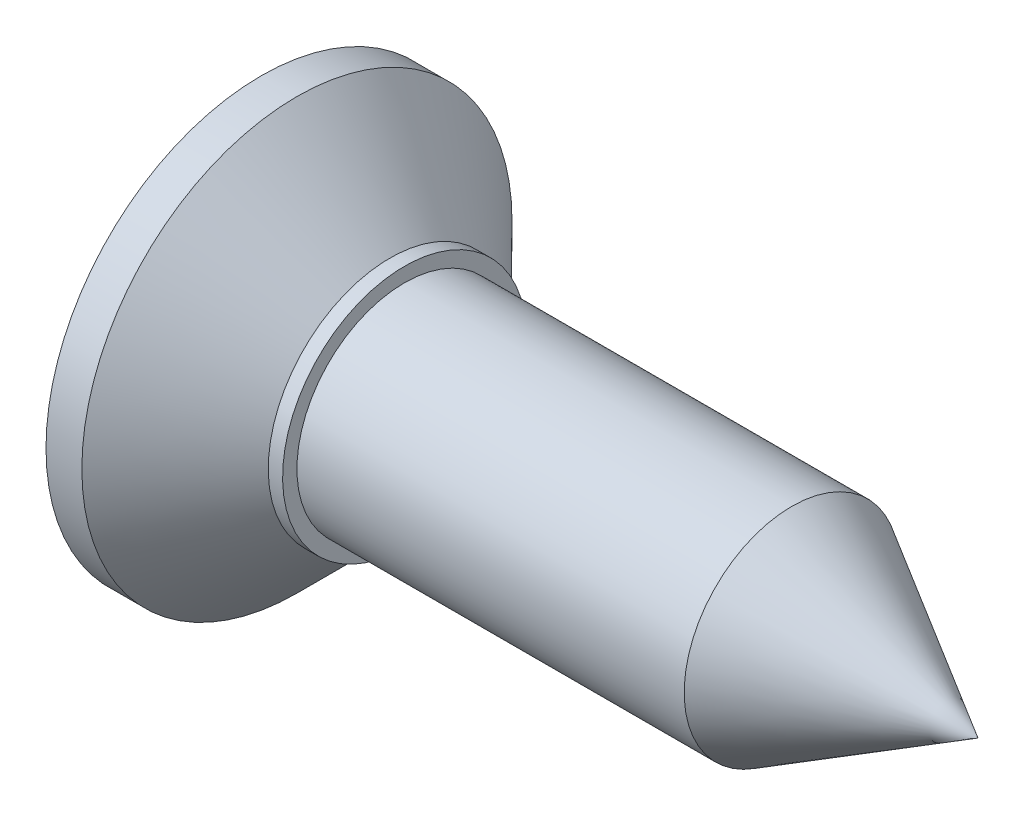
ISO-10303-21;
HEADER;
FILE_DESCRIPTION(('STEP AP214'),'2;1');
FILE_NAME('part.step','',(''),(''),'','','');
FILE_SCHEMA(('AUTOMOTIVE_DESIGN { 1 0 10303 214 1 1 1 1 }'));
ENDSEC;
DATA;
#1=APPLICATION_CONTEXT('core data for automotive mechanical design processes');
#2=APPLICATION_PROTOCOL_DEFINITION('international standard','automotive_design',2000,#1);
#3=PRODUCT_CONTEXT('',#1,'mechanical');
#4=PRODUCT('Part','Part','',(#3));
#5=PRODUCT_RELATED_PRODUCT_CATEGORY('part','',(#4));
#6=PRODUCT_DEFINITION_FORMATION('','',#4);
#7=PRODUCT_DEFINITION_CONTEXT('part definition',#1,'design');
#8=PRODUCT_DEFINITION('design','',#6,#7);
#9=PRODUCT_DEFINITION_SHAPE('','',#8);
#10=(LENGTH_UNIT() NAMED_UNIT(*) SI_UNIT(.MILLI.,.METRE.));
#11=(NAMED_UNIT(*) PLANE_ANGLE_UNIT() SI_UNIT($,.RADIAN.));
#12=(NAMED_UNIT(*) SI_UNIT($,.STERADIAN.) SOLID_ANGLE_UNIT());
#13=UNCERTAINTY_MEASURE_WITH_UNIT(LENGTH_MEASURE(1.E-05),#10,'distance_accuracy_value','');
#14=(GEOMETRIC_REPRESENTATION_CONTEXT(3) GLOBAL_UNCERTAINTY_ASSIGNED_CONTEXT((#13)) GLOBAL_UNIT_ASSIGNED_CONTEXT((#10,
#11,#12)) REPRESENTATION_CONTEXT('',''));
#15=CARTESIAN_POINT('',(0.,0.,0.));
#16=DIRECTION('',(0.,0.,1.));
#17=DIRECTION('',(1.,0.,0.));
#18=AXIS2_PLACEMENT_3D('',#15,#16,#17);
#19=CARTESIAN_POINT('',(0.,1.55,0.31));
#20=DIRECTION('',(0.,1.,0.));
#21=DIRECTION('',(0.,0.,1.));
#22=AXIS2_PLACEMENT_3D('',#19,#20,#21);
#23=PLANE('',#22);
#24=DIRECTION('',(-1.,0.,0.));
#25=VECTOR('',#24,1.);
#26=CARTESIAN_POINT('',(0.9,1.55,0.31));
#27=LINE('',#26,#25);
#28=CARTESIAN_POINT('',(0.9,1.55,0.31));
#29=VERTEX_POINT('',#28);
#30=CARTESIAN_POINT('',(0.,1.55,0.31));
#31=VERTEX_POINT('',#30);
#32=EDGE_CURVE('E11',#29,#31,#27,.T.);
#33=ORIENTED_EDGE('',*,*,#32,.T.);
#34=DIRECTION('',(0.,0.,-1.));
#35=VECTOR('',#34,1.);
#36=CARTESIAN_POINT('',(0.,1.55,0.31));
#37=LINE('',#36,#35);
#38=CARTESIAN_POINT('',(0.,1.55,-0.31));
#39=VERTEX_POINT('',#38);
#40=EDGE_CURVE('E27',#31,#39,#37,.T.);
#41=ORIENTED_EDGE('',*,*,#40,.T.);
#42=DIRECTION('',(-1.,0.,0.));
#43=VECTOR('',#42,1.);
#44=CARTESIAN_POINT('',(0.9,1.55,-0.31));
#45=LINE('',#44,#43);
#46=CARTESIAN_POINT('',(0.9,1.55,-0.31));
#47=VERTEX_POINT('',#46);
#48=EDGE_CURVE('E302',#47,#39,#45,.T.);
#49=ORIENTED_EDGE('',*,*,#48,.F.);
#50=DIRECTION('',(0.,0.,1.));
#51=VECTOR('',#50,1.);
#52=CARTESIAN_POINT('',(0.9,1.55,-0.31));
#53=LINE('',#52,#51);
#54=EDGE_CURVE('E394',#47,#29,#53,.T.);
#55=ORIENTED_EDGE('',*,*,#54,.T.);
#56=EDGE_LOOP('',(#33,#41,#49,#55));
#57=FACE_BOUND('',#56,.T.);
#58=ADVANCED_FACE('F17',(#57),#23,.F.);
#59=CARTESIAN_POINT('',(0.9,0.,0.));
#60=DIRECTION('',(1.,0.,0.));
#61=DIRECTION('',(0.,0.,-1.));
#62=AXIS2_PLACEMENT_3D('',#59,#60,#61);
#63=PLANE('',#62);
#64=DIRECTION('',(0.,0.642787609686505,0.766044443119007));
#65=VECTOR('',#64,1.);
#66=CARTESIAN_POINT('',(0.9,-1.096015510839,-1.096015510839));
#67=LINE('',#66,#65);
#68=CARTESIAN_POINT('',(0.9,-1.096015510839,-1.096015510839));
#69=VERTEX_POINT('',#68);
#70=CARTESIAN_POINT('',(0.9,-0.4364701855944,-0.31));
#71=VERTEX_POINT('',#70);
#72=EDGE_CURVE('E388',#69,#71,#67,.T.);
#73=ORIENTED_EDGE('',*,*,#72,.T.);
#74=DIRECTION('',(0.,1.,0.));
#75=VECTOR('',#74,1.);
#76=CARTESIAN_POINT('',(0.9,-1.55,-0.31));
#77=LINE('',#76,#75);
#78=CARTESIAN_POINT('',(0.9,-1.55,-0.31));
#79=VERTEX_POINT('',#78);
#80=EDGE_CURVE('E233',#79,#71,#77,.T.);
#81=ORIENTED_EDGE('',*,*,#80,.F.);
#82=DIRECTION('',(0.,0.,-1.));
#83=VECTOR('',#82,1.);
#84=CARTESIAN_POINT('',(0.9,-1.55,0.31));
#85=LINE('',#84,#83);
#86=CARTESIAN_POINT('',(0.9,-1.55,0.31));
#87=VERTEX_POINT('',#86);
#88=EDGE_CURVE('E327',#87,#79,#85,.T.);
#89=ORIENTED_EDGE('',*,*,#88,.F.);
#90=DIRECTION('',(0.,-1.,0.));
#91=VECTOR('',#90,1.);
#92=CARTESIAN_POINT('',(0.9,-0.4364701855944,0.31));
#93=LINE('',#92,#91);
#94=CARTESIAN_POINT('',(0.9,-0.4364701855944,0.31));
#95=VERTEX_POINT('',#94);
#96=EDGE_CURVE('E238',#95,#87,#93,.T.);
#97=ORIENTED_EDGE('',*,*,#96,.F.);
#98=DIRECTION('',(0.,-0.642787609686505,0.766044443119007));
#99=VECTOR('',#98,1.);
#100=CARTESIAN_POINT('',(0.9,-0.4364701855944,0.31));
#101=LINE('',#100,#99);
#102=CARTESIAN_POINT('',(0.9,-1.096015510839,1.096015510839));
#103=VERTEX_POINT('',#102);
#104=EDGE_CURVE('E385',#95,#103,#101,.T.);
#105=ORIENTED_EDGE('',*,*,#104,.T.);
#106=DIRECTION('',(0.,0.766044443119007,-0.642787609686505));
#107=VECTOR('',#106,1.);
#108=CARTESIAN_POINT('',(0.9,-1.096015510839,1.096015510839));
#109=LINE('',#108,#107);
#110=CARTESIAN_POINT('',(0.9,-0.31,0.4364701855944));
#111=VERTEX_POINT('',#110);
#112=EDGE_CURVE('E379',#103,#111,#109,.T.);
#113=ORIENTED_EDGE('',*,*,#112,.T.);
#114=DIRECTION('',(0.,0.,-1.));
#115=VECTOR('',#114,1.);
#116=CARTESIAN_POINT('',(0.9,-0.31,1.55));
#117=LINE('',#116,#115);
#118=CARTESIAN_POINT('',(0.9,-0.31,1.55));
#119=VERTEX_POINT('',#118);
#120=EDGE_CURVE('E253',#119,#111,#117,.T.);
#121=ORIENTED_EDGE('',*,*,#120,.F.);
#122=DIRECTION('',(0.,-1.,0.));
#123=VECTOR('',#122,1.);
#124=CARTESIAN_POINT('',(0.9,0.31,1.55));
#125=LINE('',#124,#123);
#126=CARTESIAN_POINT('',(0.9,0.31,1.55));
#127=VERTEX_POINT('',#126);
#128=EDGE_CURVE('E315',#127,#119,#125,.T.);
#129=ORIENTED_EDGE('',*,*,#128,.F.);
#130=DIRECTION('',(0.,0.,1.));
#131=VECTOR('',#130,1.);
#132=CARTESIAN_POINT('',(0.9,0.31,0.4364701855944));
#133=LINE('',#132,#131);
#134=CARTESIAN_POINT('',(0.9,0.31,0.4364701855944));
#135=VERTEX_POINT('',#134);
#136=EDGE_CURVE('E258',#135,#127,#133,.T.);
#137=ORIENTED_EDGE('',*,*,#136,.F.);
#138=DIRECTION('',(0.,0.766044443119007,0.642787609686505));
#139=VECTOR('',#138,1.);
#140=CARTESIAN_POINT('',(0.9,0.31,0.4364701855944));
#141=LINE('',#140,#139);
#142=CARTESIAN_POINT('',(0.9,1.096015510839,1.096015510839));
#143=VERTEX_POINT('',#142);
#144=EDGE_CURVE('E376',#135,#143,#141,.T.);
#145=ORIENTED_EDGE('',*,*,#144,.T.);
#146=DIRECTION('',(0.,-0.642787609686505,-0.766044443119007));
#147=VECTOR('',#146,1.);
#148=CARTESIAN_POINT('',(0.9,1.096015510839,1.096015510839));
#149=LINE('',#148,#147);
#150=CARTESIAN_POINT('',(0.9,0.4364701855944,0.31));
#151=VERTEX_POINT('',#150);
#152=EDGE_CURVE('E369',#143,#151,#149,.T.);
#153=ORIENTED_EDGE('',*,*,#152,.T.);
#154=DIRECTION('',(0.,-1.,0.));
#155=VECTOR('',#154,1.);
#156=CARTESIAN_POINT('',(0.9,1.55,0.31));
#157=LINE('',#156,#155);
#158=EDGE_CURVE('E305',#29,#151,#157,.T.);
#159=ORIENTED_EDGE('',*,*,#158,.F.);
#160=ORIENTED_EDGE('',*,*,#54,.F.);
#161=DIRECTION('',(0.,1.,0.));
#162=VECTOR('',#161,1.);
#163=CARTESIAN_POINT('',(0.9,0.4364701855944,-0.31));
#164=LINE('',#163,#162);
#165=CARTESIAN_POINT('',(0.9,0.4364701855944,-0.31));
#166=VERTEX_POINT('',#165);
#167=EDGE_CURVE('E370',#166,#47,#164,.T.);
#168=ORIENTED_EDGE('',*,*,#167,.F.);
#169=DIRECTION('',(0.,0.642787609686505,-0.766044443119007));
#170=VECTOR('',#169,1.);
#171=CARTESIAN_POINT('',(0.9,0.4364701855944,-0.31));
#172=LINE('',#171,#170);
#173=CARTESIAN_POINT('',(0.9,1.096015510839,-1.096015510839));
#174=VERTEX_POINT('',#173);
#175=EDGE_CURVE('E366',#166,#174,#172,.T.);
#176=ORIENTED_EDGE('',*,*,#175,.T.);
#177=DIRECTION('',(0.,-0.766044443119007,0.642787609686505));
#178=VECTOR('',#177,1.);
#179=CARTESIAN_POINT('',(0.9,1.096015510839,-1.096015510839));
#180=LINE('',#179,#178);
#181=CARTESIAN_POINT('',(0.9,0.31,-0.4364701855944));
#182=VERTEX_POINT('',#181);
#183=EDGE_CURVE('E363',#174,#182,#180,.T.);
#184=ORIENTED_EDGE('',*,*,#183,.T.);
#185=DIRECTION('',(0.,0.,1.));
#186=VECTOR('',#185,1.);
#187=CARTESIAN_POINT('',(0.9,0.31,-1.55));
#188=LINE('',#187,#186);
#189=CARTESIAN_POINT('',(0.9,0.31,-1.55));
#190=VERTEX_POINT('',#189);
#191=EDGE_CURVE('E283',#190,#182,#188,.T.);
#192=ORIENTED_EDGE('',*,*,#191,.F.);
#193=DIRECTION('',(0.,1.,0.));
#194=VECTOR('',#193,1.);
#195=CARTESIAN_POINT('',(0.9,-0.31,-1.55));
#196=LINE('',#195,#194);
#197=CARTESIAN_POINT('',(0.9,-0.31,-1.55));
#198=VERTEX_POINT('',#197);
#199=EDGE_CURVE('E359',#198,#190,#196,.T.);
#200=ORIENTED_EDGE('',*,*,#199,.F.);
#201=DIRECTION('',(0.,0.,-1.));
#202=VECTOR('',#201,1.);
#203=CARTESIAN_POINT('',(0.9,-0.31,-0.4364701855944));
#204=LINE('',#203,#202);
#205=CARTESIAN_POINT('',(0.9,-0.31,-0.4364701855944));
#206=VERTEX_POINT('',#205);
#207=EDGE_CURVE('E345',#206,#198,#204,.T.);
#208=ORIENTED_EDGE('',*,*,#207,.F.);
#209=DIRECTION('',(0.,-0.766044443119007,-0.642787609686505));
#210=VECTOR('',#209,1.);
#211=CARTESIAN_POINT('',(0.9,-0.31,-0.4364701855944));
#212=LINE('',#211,#210);
#213=EDGE_CURVE('E340',#206,#69,#212,.T.);
#214=ORIENTED_EDGE('',*,*,#213,.T.);
#215=EDGE_LOOP('',(#73,#81,#89,#97,#105,#113,#121,#129,#137,#145,#153,#159,#160,#168,#176,#184,
#192,#200,#208,#214));
#216=FACE_BOUND('',#215,.T.);
#217=ADVANCED_FACE('F174',(#216),#63,.F.);
#218=CARTESIAN_POINT('',(0.,-0.236243892334,-0.3745814628548));
#219=DIRECTION('',(0.,0.642787609686505,-0.766044443119007));
#220=DIRECTION('',(0.,0.766044443119007,0.642787609686505));
#221=AXIS2_PLACEMENT_3D('',#218,#219,#220);
#222=PLANE('',#221);
#223=DIRECTION('',(0.,0.766044443119007,0.642787609686505));
#224=VECTOR('',#223,1.);
#225=CARTESIAN_POINT('',(0.,-1.096015510839,-1.096015510839));
#226=LINE('',#225,#224);
#227=CARTESIAN_POINT('',(0.,-1.096015510839,-1.096015510839));
#228=VERTEX_POINT('',#227);
#229=CARTESIAN_POINT('',(0.,-0.31,-0.4364701855944));
#230=VERTEX_POINT('',#229);
#231=EDGE_CURVE('E330',#228,#230,#226,.T.);
#232=ORIENTED_EDGE('',*,*,#231,.F.);
#233=DIRECTION('',(-1.,0.,0.));
#234=VECTOR('',#233,1.);
#235=CARTESIAN_POINT('',(0.9,-1.096015510839,-1.096015510839));
#236=LINE('',#235,#234);
#237=EDGE_CURVE('E223',#69,#228,#236,.T.);
#238=ORIENTED_EDGE('',*,*,#237,.F.);
#239=ORIENTED_EDGE('',*,*,#213,.F.);
#240=DIRECTION('',(-1.,0.,0.));
#241=VECTOR('',#240,1.);
#242=CARTESIAN_POINT('',(0.9,-0.31,-0.4364701855944));
#243=LINE('',#242,#241);
#244=EDGE_CURVE('E343',#206,#230,#243,.T.);
#245=ORIENTED_EDGE('',*,*,#244,.T.);
#246=EDGE_LOOP('',(#232,#238,#239,#245));
#247=FACE_BOUND('',#246,.T.);
#248=ADVANCED_FACE('F180',(#247),#222,.F.);
#249=CARTESIAN_POINT('',(0.,-0.31,-1.55));
#250=DIRECTION('',(0.,-1.,0.));
#251=DIRECTION('',(0.,0.,-1.));
#252=AXIS2_PLACEMENT_3D('',#249,#250,#251);
#253=PLANE('',#252);
#254=ORIENTED_EDGE('',*,*,#207,.T.);
#255=DIRECTION('',(-1.,0.,0.));
#256=VECTOR('',#255,1.);
#257=CARTESIAN_POINT('',(0.9,-0.31,-1.55));
#258=LINE('',#257,#256);
#259=CARTESIAN_POINT('',(0.,-0.31,-1.55));
#260=VERTEX_POINT('',#259);
#261=EDGE_CURVE('E346',#198,#260,#258,.T.);
#262=ORIENTED_EDGE('',*,*,#261,.T.);
#263=DIRECTION('',(0.,0.,1.));
#264=VECTOR('',#263,1.);
#265=CARTESIAN_POINT('',(0.,-0.31,-1.55));
#266=LINE('',#265,#264);
#267=EDGE_CURVE('E349',#260,#230,#266,.T.);
#268=ORIENTED_EDGE('',*,*,#267,.T.);
#269=ORIENTED_EDGE('',*,*,#244,.F.);
#270=EDGE_LOOP('',(#254,#262,#268,#269));
#271=FACE_BOUND('',#270,.T.);
#272=ADVANCED_FACE('F186',(#271),#253,.F.);
#273=CARTESIAN_POINT('',(0.,1.5,0.));
#274=DIRECTION('',(-1.,0.,0.));
#275=DIRECTION('',(0.,1.,0.));
#276=AXIS2_PLACEMENT_3D('',#273,#274,#275);
#277=PLANE('',#276);
#278=CARTESIAN_POINT('',(0.,0.,0.));
#279=DIRECTION('',(-1.,0.,0.));
#280=DIRECTION('',(0.,-1.,0.));
#281=AXIS2_PLACEMENT_3D('',#278,#279,#280);
#282=CIRCLE('',#281,3.);
#283=CARTESIAN_POINT('',(0.,-3.,0.));
#284=VERTEX_POINT('',#283);
#285=EDGE_CURVE('E296',#284,#284,#282,.T.);
#286=ORIENTED_EDGE('',*,*,#285,.T.);
#287=EDGE_LOOP('',(#286));
#288=FACE_BOUND('',#287,.T.);
#289=ORIENTED_EDGE('',*,*,#267,.F.);
#290=DIRECTION('',(0.,-1.,0.));
#291=VECTOR('',#290,1.);
#292=CARTESIAN_POINT('',(0.,0.31,-1.55));
#293=LINE('',#292,#291);
#294=CARTESIAN_POINT('',(0.,0.31,-1.55));
#295=VERTEX_POINT('',#294);
#296=EDGE_CURVE('E291',#295,#260,#293,.T.);
#297=ORIENTED_EDGE('',*,*,#296,.F.);
#298=DIRECTION('',(0.,0.,-1.));
#299=VECTOR('',#298,1.);
#300=CARTESIAN_POINT('',(0.,0.31,-0.4364701855944));
#301=LINE('',#300,#299);
#302=CARTESIAN_POINT('',(0.,0.31,-0.4364701855944));
#303=VERTEX_POINT('',#302);
#304=EDGE_CURVE('E278',#303,#295,#301,.T.);
#305=ORIENTED_EDGE('',*,*,#304,.F.);
#306=DIRECTION('',(0.,0.766044443119007,-0.642787609686505));
#307=VECTOR('',#306,1.);
#308=CARTESIAN_POINT('',(0.,0.31,-0.4364701855944));
#309=LINE('',#308,#307);
#310=CARTESIAN_POINT('',(0.,1.096015510839,-1.096015510839));
#311=VERTEX_POINT('',#310);
#312=EDGE_CURVE('E293',#303,#311,#309,.T.);
#313=ORIENTED_EDGE('',*,*,#312,.T.);
#314=DIRECTION('',(0.,-0.642787609686505,0.766044443119007));
#315=VECTOR('',#314,1.);
#316=CARTESIAN_POINT('',(0.,1.096015510839,-1.096015510839));
#317=LINE('',#316,#315);
#318=CARTESIAN_POINT('',(0.,0.4364701855944,-0.31));
#319=VERTEX_POINT('',#318);
#320=EDGE_CURVE('E297',#311,#319,#317,.T.);
#321=ORIENTED_EDGE('',*,*,#320,.T.);
#322=DIRECTION('',(0.,-1.,0.));
#323=VECTOR('',#322,1.);
#324=CARTESIAN_POINT('',(0.,1.55,-0.31));
#325=LINE('',#324,#323);
#326=EDGE_CURVE('E273',#39,#319,#325,.T.);
#327=ORIENTED_EDGE('',*,*,#326,.F.);
#328=ORIENTED_EDGE('',*,*,#40,.F.);
#329=DIRECTION('',(0.,1.,0.));
#330=VECTOR('',#329,1.);
#331=CARTESIAN_POINT('',(0.,0.4364701855944,0.31));
#332=LINE('',#331,#330);
#333=CARTESIAN_POINT('',(0.,0.4364701855944,0.31));
#334=VERTEX_POINT('',#333);
#335=EDGE_CURVE('E269',#334,#31,#332,.T.);
#336=ORIENTED_EDGE('',*,*,#335,.F.);
#337=DIRECTION('',(0.,0.642787609686505,0.766044443119007));
#338=VECTOR('',#337,1.);
#339=CARTESIAN_POINT('',(0.,0.4364701855944,0.31));
#340=LINE('',#339,#338);
#341=CARTESIAN_POINT('',(0.,1.096015510839,1.096015510839));
#342=VERTEX_POINT('',#341);
#343=EDGE_CURVE('E300',#334,#342,#340,.T.);
#344=ORIENTED_EDGE('',*,*,#343,.T.);
#345=DIRECTION('',(0.,-0.766044443119007,-0.642787609686505));
#346=VECTOR('',#345,1.);
#347=CARTESIAN_POINT('',(0.,1.096015510839,1.096015510839));
#348=LINE('',#347,#346);
#349=CARTESIAN_POINT('',(0.,0.31,0.4364701855944));
#350=VERTEX_POINT('',#349);
#351=EDGE_CURVE('E308',#342,#350,#348,.T.);
#352=ORIENTED_EDGE('',*,*,#351,.T.);
#353=DIRECTION('',(0.,0.,-1.));
#354=VECTOR('',#353,1.);
#355=CARTESIAN_POINT('',(0.,0.31,1.55));
#356=LINE('',#355,#354);
#357=CARTESIAN_POINT('',(0.,0.31,1.55));
#358=VERTEX_POINT('',#357);
#359=EDGE_CURVE('E259',#358,#350,#356,.T.);
#360=ORIENTED_EDGE('',*,*,#359,.F.);
#361=DIRECTION('',(0.,1.,0.));
#362=VECTOR('',#361,1.);
#363=CARTESIAN_POINT('',(0.,-0.31,1.55));
#364=LINE('',#363,#362);
#365=CARTESIAN_POINT('',(0.,-0.31,1.55));
#366=VERTEX_POINT('',#365);
#367=EDGE_CURVE('E254',#366,#358,#364,.T.);
#368=ORIENTED_EDGE('',*,*,#367,.F.);
#369=DIRECTION('',(0.,0.,1.));
#370=VECTOR('',#369,1.);
#371=CARTESIAN_POINT('',(0.,-0.31,0.4364701855944));
#372=LINE('',#371,#370);
#373=CARTESIAN_POINT('',(0.,-0.31,0.4364701855944));
#374=VERTEX_POINT('',#373);
#375=EDGE_CURVE('E249',#374,#366,#372,.T.);
#376=ORIENTED_EDGE('',*,*,#375,.F.);
#377=DIRECTION('',(0.,-0.766044443119007,0.642787609686505));
#378=VECTOR('',#377,1.);
#379=CARTESIAN_POINT('',(0.,-0.31,0.4364701855944));
#380=LINE('',#379,#378);
#381=CARTESIAN_POINT('',(0.,-1.096015510839,1.096015510839));
#382=VERTEX_POINT('',#381);
#383=EDGE_CURVE('E311',#374,#382,#380,.T.);
#384=ORIENTED_EDGE('',*,*,#383,.T.);
#385=DIRECTION('',(0.,0.642787609686505,-0.766044443119007));
#386=VECTOR('',#385,1.);
#387=CARTESIAN_POINT('',(0.,-1.096015510839,1.096015510839));
#388=LINE('',#387,#386);
#389=CARTESIAN_POINT('',(0.,-0.4364701855944,0.31));
#390=VERTEX_POINT('',#389);
#391=EDGE_CURVE('E320',#382,#390,#388,.T.);
#392=ORIENTED_EDGE('',*,*,#391,.T.);
#393=DIRECTION('',(0.,1.,0.));
#394=VECTOR('',#393,1.);
#395=CARTESIAN_POINT('',(0.,-1.55,0.31));
#396=LINE('',#395,#394);
#397=CARTESIAN_POINT('',(0.,-1.55,0.31));
#398=VERTEX_POINT('',#397);
#399=EDGE_CURVE('E239',#398,#390,#396,.T.);
#400=ORIENTED_EDGE('',*,*,#399,.F.);
#401=DIRECTION('',(0.,0.,1.));
#402=VECTOR('',#401,1.);
#403=CARTESIAN_POINT('',(0.,-1.55,-0.31));
#404=LINE('',#403,#402);
#405=CARTESIAN_POINT('',(0.,-1.55,-0.31));
#406=VERTEX_POINT('',#405);
#407=EDGE_CURVE('E234',#406,#398,#404,.T.);
#408=ORIENTED_EDGE('',*,*,#407,.F.);
#409=DIRECTION('',(0.,-1.,0.));
#410=VECTOR('',#409,1.);
#411=CARTESIAN_POINT('',(0.,-0.4364701855944,-0.31));
#412=LINE('',#411,#410);
#413=CARTESIAN_POINT('',(0.,-0.4364701855944,-0.31));
#414=VERTEX_POINT('',#413);
#415=EDGE_CURVE('E151',#414,#406,#412,.T.);
#416=ORIENTED_EDGE('',*,*,#415,.F.);
#417=DIRECTION('',(0.,-0.642787609686505,-0.766044443119007));
#418=VECTOR('',#417,1.);
#419=CARTESIAN_POINT('',(0.,-0.4364701855944,-0.31));
#420=LINE('',#419,#418);
#421=EDGE_CURVE('E323',#414,#228,#420,.T.);
#422=ORIENTED_EDGE('',*,*,#421,.T.);
#423=ORIENTED_EDGE('',*,*,#231,.T.);
#424=EDGE_LOOP('',(#289,#297,#305,#313,#321,#327,#328,#336,#344,#352,#360,#368,#376,#384,#392,
#400,#408,#416,#422,#423));
#425=FACE_BOUND('',#424,.T.);
#426=ADVANCED_FACE('F190',(#288,#425),#277,.T.);
#427=CARTESIAN_POINT('',(0.25,0.,0.));
#428=DIRECTION('',(1.,0.,0.));
#429=DIRECTION('',(0.,1.,0.));
#430=AXIS2_PLACEMENT_3D('',#427,#428,#429);
#431=CYLINDRICAL_SURFACE('',#430,3.);
#432=CARTESIAN_POINT('',(0.5,0.,0.));
#433=DIRECTION('',(1.,0.,0.));
#434=DIRECTION('',(0.,-1.,0.));
#435=AXIS2_PLACEMENT_3D('',#432,#433,#434);
#436=CIRCLE('',#435,3.);
#437=CARTESIAN_POINT('',(0.5,-3.,0.));
#438=VERTEX_POINT('',#437);
#439=EDGE_CURVE('E221',#438,#438,#436,.T.);
#440=ORIENTED_EDGE('',*,*,#439,.F.);
#441=EDGE_LOOP('',(#440));
#442=FACE_BOUND('',#441,.T.);
#443=ORIENTED_EDGE('',*,*,#285,.F.);
#444=EDGE_LOOP('',(#443));
#445=FACE_BOUND('',#444,.T.);
#446=ADVANCED_FACE('F194',(#442,#445),#431,.T.);
#447=CARTESIAN_POINT('',(1.15,0.,0.));
#448=DIRECTION('',(-1.,0.,0.));
#449=DIRECTION('',(0.,1.,0.));
#450=AXIS2_PLACEMENT_3D('',#447,#448,#449);
#451=CONICAL_SURFACE('',#450,2.35,0.7853981633973);
#452=CARTESIAN_POINT('',(1.8,0.,0.));
#453=DIRECTION('',(-1.,0.,0.));
#454=DIRECTION('',(0.,-1.,0.));
#455=AXIS2_PLACEMENT_3D('',#452,#453,#454);
#456=CIRCLE('',#455,1.7);
#457=CARTESIAN_POINT('',(1.8,-1.7,0.));
#458=VERTEX_POINT('',#457);
#459=EDGE_CURVE('E332',#458,#458,#456,.T.);
#460=ORIENTED_EDGE('',*,*,#459,.T.);
#461=EDGE_LOOP('',(#460));
#462=FACE_BOUND('',#461,.T.);
#463=ORIENTED_EDGE('',*,*,#439,.T.);
#464=EDGE_LOOP('',(#463));
#465=FACE_BOUND('',#464,.T.);
#466=ADVANCED_FACE('F198',(#462,#465),#451,.T.);
#467=CARTESIAN_POINT('',(1.9,0.,0.));
#468=DIRECTION('',(1.,0.,0.));
#469=DIRECTION('',(0.,1.,0.));
#470=AXIS2_PLACEMENT_3D('',#467,#468,#469);
#471=CYLINDRICAL_SURFACE('',#470,1.7);
#472=CARTESIAN_POINT('',(2.,0.,0.));
#473=DIRECTION('',(1.,0.,0.));
#474=DIRECTION('',(0.,-1.,0.));
#475=AXIS2_PLACEMENT_3D('',#472,#473,#474);
#476=CIRCLE('',#475,1.7);
#477=CARTESIAN_POINT('',(2.,-1.7,0.));
#478=VERTEX_POINT('',#477);
#479=EDGE_CURVE('E214',#478,#478,#476,.T.);
#480=ORIENTED_EDGE('',*,*,#479,.F.);
#481=EDGE_LOOP('',(#480));
#482=FACE_BOUND('',#481,.T.);
#483=ORIENTED_EDGE('',*,*,#459,.F.);
#484=EDGE_LOOP('',(#483));
#485=FACE_BOUND('',#484,.T.);
#486=ADVANCED_FACE('F202',(#482,#485),#471,.T.);
#487=CARTESIAN_POINT('',(2.,1.6,0.));
#488=DIRECTION('',(1.,0.,0.));
#489=DIRECTION('',(0.,-1.,0.));
#490=AXIS2_PLACEMENT_3D('',#487,#488,#489);
#491=PLANE('',#490);
#492=ORIENTED_EDGE('',*,*,#479,.T.);
#493=EDGE_LOOP('',(#492));
#494=FACE_BOUND('',#493,.T.);
#495=CARTESIAN_POINT('',(2.,0.,0.));
#496=DIRECTION('',(-1.,0.,0.));
#497=DIRECTION('',(0.,-1.,0.));
#498=AXIS2_PLACEMENT_3D('',#495,#496,#497);
#499=CIRCLE('',#498,1.5);
#500=CARTESIAN_POINT('',(2.,-1.5,0.));
#501=VERTEX_POINT('',#500);
#502=EDGE_CURVE('E217',#501,#501,#499,.T.);
#503=ORIENTED_EDGE('',*,*,#502,.T.);
#504=EDGE_LOOP('',(#503));
#505=FACE_BOUND('',#504,.T.);
#506=ADVANCED_FACE('F169',(#494,#505),#491,.T.);
#507=CARTESIAN_POINT('',(4.700961894323,0.,0.));
#508=DIRECTION('',(1.,0.,0.));
#509=DIRECTION('',(0.,1.,0.));
#510=AXIS2_PLACEMENT_3D('',#507,#508,#509);
#511=CYLINDRICAL_SURFACE('',#510,1.5);
#512=CARTESIAN_POINT('',(7.401923788647,0.,0.));
#513=DIRECTION('',(1.,0.,0.));
#514=DIRECTION('',(0.,-1.,0.));
#515=AXIS2_PLACEMENT_3D('',#512,#513,#514);
#516=CIRCLE('',#515,1.5);
#517=CARTESIAN_POINT('',(7.401923788647,-1.5,0.));
#518=VERTEX_POINT('',#517);
#519=EDGE_CURVE('E219',#518,#518,#516,.T.);
#520=ORIENTED_EDGE('',*,*,#519,.F.);
#521=EDGE_LOOP('',(#520));
#522=FACE_BOUND('',#521,.T.);
#523=ORIENTED_EDGE('',*,*,#502,.F.);
#524=EDGE_LOOP('',(#523));
#525=FACE_BOUND('',#524,.T.);
#526=ADVANCED_FACE('F158',(#522,#525),#511,.T.);
#527=CARTESIAN_POINT('',(8.67498113221,0.,0.));
#528=DIRECTION('',(-1.,0.,0.));
#529=DIRECTION('',(0.,1.,0.));
#530=AXIS2_PLACEMENT_3D('',#527,#528,#529);
#531=CONICAL_SURFACE('',#530,0.765,0.5235987755982);
#532=ORIENTED_EDGE('',*,*,#519,.T.);
#533=EDGE_LOOP('',(#532));
#534=FACE_BOUND('',#533,.T.);
#535=CARTESIAN_POINT('',(10.,0.,0.));
#536=VERTEX_POINT('',#535);
#537=VERTEX_LOOP('',#536);
#538=FACE_BOUND('',#537,.T.);
#539=ADVANCED_FACE('F155',(#534,#538),#531,.T.);
#540=CARTESIAN_POINT('',(0.,-1.096015510839,-1.096015510839));
#541=DIRECTION('',(0.,-0.766044443119007,0.642787609686505));
#542=DIRECTION('',(0.,-0.642787609686505,-0.766044443119007));
#543=AXIS2_PLACEMENT_3D('',#540,#541,#542);
#544=PLANE('',#543);
#545=ORIENTED_EDGE('',*,*,#72,.F.);
#546=ORIENTED_EDGE('',*,*,#237,.T.);
#547=ORIENTED_EDGE('',*,*,#421,.F.);
#548=DIRECTION('',(1.,0.,0.));
#549=VECTOR('',#548,1.);
#550=CARTESIAN_POINT('',(0.,-0.4364701855944,-0.31));
#551=LINE('',#550,#549);
#552=EDGE_CURVE('E227',#414,#71,#551,.T.);
#553=ORIENTED_EDGE('',*,*,#552,.T.);
#554=EDGE_LOOP('',(#545,#546,#547,#553));
#555=FACE_BOUND('',#554,.T.);
#556=ADVANCED_FACE('F157',(#555),#544,.F.);
#557=CARTESIAN_POINT('',(0.,-0.31,-0.31));
#558=DIRECTION('',(0.,0.,-1.));
#559=DIRECTION('',(0.,1.,0.));
#560=AXIS2_PLACEMENT_3D('',#557,#558,#559);
#561=PLANE('',#560);
#562=ORIENTED_EDGE('',*,*,#415,.T.);
#563=DIRECTION('',(-1.,0.,0.));
#564=VECTOR('',#563,1.);
#565=CARTESIAN_POINT('',(0.9,-1.55,-0.31));
#566=LINE('',#565,#564);
#567=EDGE_CURVE('E230',#79,#406,#566,.T.);
#568=ORIENTED_EDGE('',*,*,#567,.F.);
#569=ORIENTED_EDGE('',*,*,#80,.T.);
#570=ORIENTED_EDGE('',*,*,#552,.F.);
#571=EDGE_LOOP('',(#562,#568,#569,#570));
#572=FACE_BOUND('',#571,.T.);
#573=ADVANCED_FACE('F166',(#572),#561,.F.);
#574=CARTESIAN_POINT('',(0.,-1.55,-0.31));
#575=DIRECTION('',(0.,-1.,0.));
#576=DIRECTION('',(0.,0.,-1.));
#577=AXIS2_PLACEMENT_3D('',#574,#575,#576);
#578=PLANE('',#577);
#579=ORIENTED_EDGE('',*,*,#567,.T.);
#580=ORIENTED_EDGE('',*,*,#407,.T.);
#581=DIRECTION('',(-1.,0.,0.));
#582=VECTOR('',#581,1.);
#583=CARTESIAN_POINT('',(0.9,-1.55,0.31));
#584=LINE('',#583,#582);
#585=EDGE_CURVE('E235',#87,#398,#584,.T.);
#586=ORIENTED_EDGE('',*,*,#585,.F.);
#587=ORIENTED_EDGE('',*,*,#88,.T.);
#588=EDGE_LOOP('',(#579,#580,#586,#587));
#589=FACE_BOUND('',#588,.T.);
#590=ADVANCED_FACE('F456',(#589),#578,.F.);
#591=CARTESIAN_POINT('',(0.,-1.55,0.31));
#592=DIRECTION('',(0.,0.,1.));
#593=DIRECTION('',(0.,-1.,0.));
#594=AXIS2_PLACEMENT_3D('',#591,#592,#593);
#595=PLANE('',#594);
#596=ORIENTED_EDGE('',*,*,#96,.T.);
#597=ORIENTED_EDGE('',*,*,#585,.T.);
#598=ORIENTED_EDGE('',*,*,#399,.T.);
#599=DIRECTION('',(-1.,0.,0.));
#600=VECTOR('',#599,1.);
#601=CARTESIAN_POINT('',(0.9,-0.4364701855944,0.31));
#602=LINE('',#601,#600);
#603=EDGE_CURVE('E240',#95,#390,#602,.T.);
#604=ORIENTED_EDGE('',*,*,#603,.F.);
#605=EDGE_LOOP('',(#596,#597,#598,#604));
#606=FACE_BOUND('',#605,.T.);
#607=ADVANCED_FACE('F452',(#606),#595,.F.);
#608=CARTESIAN_POINT('',(0.,-0.3745814628548,0.236243892334));
#609=DIRECTION('',(0.,-0.766044443119007,-0.642787609686505));
#610=DIRECTION('',(0.,0.642787609686505,-0.766044443119007));
#611=AXIS2_PLACEMENT_3D('',#608,#609,#610);
#612=PLANE('',#611);
#613=ORIENTED_EDGE('',*,*,#391,.F.);
#614=DIRECTION('',(-1.,0.,0.));
#615=VECTOR('',#614,1.);
#616=CARTESIAN_POINT('',(0.9,-1.096015510839,1.096015510839));
#617=LINE('',#616,#615);
#618=EDGE_CURVE('E243',#103,#382,#617,.T.);
#619=ORIENTED_EDGE('',*,*,#618,.F.);
#620=ORIENTED_EDGE('',*,*,#104,.F.);
#621=ORIENTED_EDGE('',*,*,#603,.T.);
#622=EDGE_LOOP('',(#613,#619,#620,#621));
#623=FACE_BOUND('',#622,.T.);
#624=ADVANCED_FACE('F448',(#623),#612,.F.);
#625=CARTESIAN_POINT('',(0.,-1.096015510839,1.096015510839));
#626=DIRECTION('',(0.,0.642787609686505,0.766044443119007));
#627=DIRECTION('',(0.,-0.766044443119007,0.642787609686505));
#628=AXIS2_PLACEMENT_3D('',#625,#626,#627);
#629=PLANE('',#628);
#630=ORIENTED_EDGE('',*,*,#112,.F.);
#631=ORIENTED_EDGE('',*,*,#618,.T.);
#632=ORIENTED_EDGE('',*,*,#383,.F.);
#633=DIRECTION('',(1.,0.,0.));
#634=VECTOR('',#633,1.);
#635=CARTESIAN_POINT('',(0.,-0.31,0.4364701855944));
#636=LINE('',#635,#634);
#637=EDGE_CURVE('E246',#374,#111,#636,.T.);
#638=ORIENTED_EDGE('',*,*,#637,.T.);
#639=EDGE_LOOP('',(#630,#631,#632,#638));
#640=FACE_BOUND('',#639,.T.);
#641=ADVANCED_FACE('F444',(#640),#629,.F.);
#642=CARTESIAN_POINT('',(0.,-0.31,0.31));
#643=DIRECTION('',(0.,-1.,0.));
#644=DIRECTION('',(0.,0.,-1.));
#645=AXIS2_PLACEMENT_3D('',#642,#643,#644);
#646=PLANE('',#645);
#647=ORIENTED_EDGE('',*,*,#375,.T.);
#648=DIRECTION('',(-1.,0.,0.));
#649=VECTOR('',#648,1.);
#650=CARTESIAN_POINT('',(0.9,-0.31,1.55));
#651=LINE('',#650,#649);
#652=EDGE_CURVE('E250',#119,#366,#651,.T.);
#653=ORIENTED_EDGE('',*,*,#652,.F.);
#654=ORIENTED_EDGE('',*,*,#120,.T.);
#655=ORIENTED_EDGE('',*,*,#637,.F.);
#656=EDGE_LOOP('',(#647,#653,#654,#655));
#657=FACE_BOUND('',#656,.T.);
#658=ADVANCED_FACE('F440',(#657),#646,.F.);
#659=CARTESIAN_POINT('',(0.,-0.31,1.55));
#660=DIRECTION('',(0.,0.,1.));
#661=DIRECTION('',(0.,-1.,0.));
#662=AXIS2_PLACEMENT_3D('',#659,#660,#661);
#663=PLANE('',#662);
#664=ORIENTED_EDGE('',*,*,#652,.T.);
#665=ORIENTED_EDGE('',*,*,#367,.T.);
#666=DIRECTION('',(-1.,0.,0.));
#667=VECTOR('',#666,1.);
#668=CARTESIAN_POINT('',(0.9,0.31,1.55));
#669=LINE('',#668,#667);
#670=EDGE_CURVE('E255',#127,#358,#669,.T.);
#671=ORIENTED_EDGE('',*,*,#670,.F.);
#672=ORIENTED_EDGE('',*,*,#128,.T.);
#673=EDGE_LOOP('',(#664,#665,#671,#672));
#674=FACE_BOUND('',#673,.T.);
#675=ADVANCED_FACE('F436',(#674),#663,.F.);
#676=CARTESIAN_POINT('',(0.,0.31,1.55));
#677=DIRECTION('',(0.,1.,0.));
#678=DIRECTION('',(0.,0.,1.));
#679=AXIS2_PLACEMENT_3D('',#676,#677,#678);
#680=PLANE('',#679);
#681=ORIENTED_EDGE('',*,*,#136,.T.);
#682=ORIENTED_EDGE('',*,*,#670,.T.);
#683=ORIENTED_EDGE('',*,*,#359,.T.);
#684=DIRECTION('',(-1.,0.,0.));
#685=VECTOR('',#684,1.);
#686=CARTESIAN_POINT('',(0.9,0.31,0.4364701855944));
#687=LINE('',#686,#685);
#688=EDGE_CURVE('E260',#135,#350,#687,.T.);
#689=ORIENTED_EDGE('',*,*,#688,.F.);
#690=EDGE_LOOP('',(#681,#682,#683,#689));
#691=FACE_BOUND('',#690,.T.);
#692=ADVANCED_FACE('F432',(#691),#680,.F.);
#693=CARTESIAN_POINT('',(0.,0.236243892334,0.3745814628548));
#694=DIRECTION('',(0.,-0.642787609686505,0.766044443119007));
#695=DIRECTION('',(0.,-0.766044443119007,-0.642787609686505));
#696=AXIS2_PLACEMENT_3D('',#693,#694,#695);
#697=PLANE('',#696);
#698=ORIENTED_EDGE('',*,*,#351,.F.);
#699=DIRECTION('',(-1.,0.,0.));
#700=VECTOR('',#699,1.);
#701=CARTESIAN_POINT('',(0.9,1.096015510839,1.096015510839));
#702=LINE('',#701,#700);
#703=EDGE_CURVE('E263',#143,#342,#702,.T.);
#704=ORIENTED_EDGE('',*,*,#703,.F.);
#705=ORIENTED_EDGE('',*,*,#144,.F.);
#706=ORIENTED_EDGE('',*,*,#688,.T.);
#707=EDGE_LOOP('',(#698,#704,#705,#706));
#708=FACE_BOUND('',#707,.T.);
#709=ADVANCED_FACE('F428',(#708),#697,.F.);
#710=CARTESIAN_POINT('',(0.,1.096015510839,1.096015510839));
#711=DIRECTION('',(0.,0.766044443119007,-0.642787609686505));
#712=DIRECTION('',(0.,0.642787609686505,0.766044443119007));
#713=AXIS2_PLACEMENT_3D('',#710,#711,#712);
#714=PLANE('',#713);
#715=ORIENTED_EDGE('',*,*,#152,.F.);
#716=ORIENTED_EDGE('',*,*,#703,.T.);
#717=ORIENTED_EDGE('',*,*,#343,.F.);
#718=DIRECTION('',(1.,0.,0.));
#719=VECTOR('',#718,1.);
#720=CARTESIAN_POINT('',(0.,0.4364701855944,0.31));
#721=LINE('',#720,#719);
#722=EDGE_CURVE('E266',#334,#151,#721,.T.);
#723=ORIENTED_EDGE('',*,*,#722,.T.);
#724=EDGE_LOOP('',(#715,#716,#717,#723));
#725=FACE_BOUND('',#724,.T.);
#726=ADVANCED_FACE('F424',(#725),#714,.F.);
#727=CARTESIAN_POINT('',(0.,0.31,0.31));
#728=DIRECTION('',(0.,0.,1.));
#729=DIRECTION('',(0.,-1.,0.));
#730=AXIS2_PLACEMENT_3D('',#727,#728,#729);
#731=PLANE('',#730);
#732=ORIENTED_EDGE('',*,*,#335,.T.);
#733=ORIENTED_EDGE('',*,*,#32,.F.);
#734=ORIENTED_EDGE('',*,*,#158,.T.);
#735=ORIENTED_EDGE('',*,*,#722,.F.);
#736=EDGE_LOOP('',(#732,#733,#734,#735));
#737=FACE_BOUND('',#736,.T.);
#738=ADVANCED_FACE('F421',(#737),#731,.F.);
#739=CARTESIAN_POINT('',(0.,1.55,-0.31));
#740=DIRECTION('',(0.,0.,-1.));
#741=DIRECTION('',(0.,1.,0.));
#742=AXIS2_PLACEMENT_3D('',#739,#740,#741);
#743=PLANE('',#742);
#744=ORIENTED_EDGE('',*,*,#167,.T.);
#745=ORIENTED_EDGE('',*,*,#48,.T.);
#746=ORIENTED_EDGE('',*,*,#326,.T.);
#747=DIRECTION('',(-1.,0.,0.));
#748=VECTOR('',#747,1.);
#749=CARTESIAN_POINT('',(0.9,0.4364701855944,-0.31));
#750=LINE('',#749,#748);
#751=EDGE_CURVE('E270',#166,#319,#750,.T.);
#752=ORIENTED_EDGE('',*,*,#751,.F.);
#753=EDGE_LOOP('',(#744,#745,#746,#752));
#754=FACE_BOUND('',#753,.T.);
#755=ADVANCED_FACE('F402',(#754),#743,.F.);
#756=CARTESIAN_POINT('',(0.,0.3745814628548,-0.236243892334));
#757=DIRECTION('',(0.,0.766044443119007,0.642787609686505));
#758=DIRECTION('',(0.,-0.642787609686505,0.766044443119007));
#759=AXIS2_PLACEMENT_3D('',#756,#757,#758);
#760=PLANE('',#759);
#761=ORIENTED_EDGE('',*,*,#320,.F.);
#762=DIRECTION('',(-1.,0.,0.));
#763=VECTOR('',#762,1.);
#764=CARTESIAN_POINT('',(0.9,1.096015510839,-1.096015510839));
#765=LINE('',#764,#763);
#766=EDGE_CURVE('E274',#174,#311,#765,.T.);
#767=ORIENTED_EDGE('',*,*,#766,.F.);
#768=ORIENTED_EDGE('',*,*,#175,.F.);
#769=ORIENTED_EDGE('',*,*,#751,.T.);
#770=EDGE_LOOP('',(#761,#767,#768,#769));
#771=FACE_BOUND('',#770,.T.);
#772=ADVANCED_FACE('F407',(#771),#760,.F.);
#773=CARTESIAN_POINT('',(0.,1.096015510839,-1.096015510839));
#774=DIRECTION('',(0.,-0.642787609686505,-0.766044443119007));
#775=DIRECTION('',(0.,0.766044443119007,-0.642787609686505));
#776=AXIS2_PLACEMENT_3D('',#773,#774,#775);
#777=PLANE('',#776);
#778=ORIENTED_EDGE('',*,*,#183,.F.);
#779=ORIENTED_EDGE('',*,*,#766,.T.);
#780=ORIENTED_EDGE('',*,*,#312,.F.);
#781=DIRECTION('',(1.,0.,0.));
#782=VECTOR('',#781,1.);
#783=CARTESIAN_POINT('',(0.,0.31,-0.4364701855944));
#784=LINE('',#783,#782);
#785=EDGE_CURVE('E276',#303,#182,#784,.T.);
#786=ORIENTED_EDGE('',*,*,#785,.T.);
#787=EDGE_LOOP('',(#778,#779,#780,#786));
#788=FACE_BOUND('',#787,.T.);
#789=ADVANCED_FACE('F408',(#788),#777,.F.);
#790=CARTESIAN_POINT('',(0.,0.31,-0.31));
#791=DIRECTION('',(0.,1.,0.));
#792=DIRECTION('',(0.,0.,1.));
#793=AXIS2_PLACEMENT_3D('',#790,#791,#792);
#794=PLANE('',#793);
#795=ORIENTED_EDGE('',*,*,#304,.T.);
#796=DIRECTION('',(-1.,0.,0.));
#797=VECTOR('',#796,1.);
#798=CARTESIAN_POINT('',(0.9,0.31,-1.55));
#799=LINE('',#798,#797);
#800=EDGE_CURVE('E21',#190,#295,#799,.T.);
#801=ORIENTED_EDGE('',*,*,#800,.F.);
#802=ORIENTED_EDGE('',*,*,#191,.T.);
#803=ORIENTED_EDGE('',*,*,#785,.F.);
#804=EDGE_LOOP('',(#795,#801,#802,#803));
#805=FACE_BOUND('',#804,.T.);
#806=ADVANCED_FACE('F409',(#805),#794,.F.);
#807=CARTESIAN_POINT('',(0.,0.31,-1.55));
#808=DIRECTION('',(0.,0.,-1.));
#809=DIRECTION('',(0.,1.,0.));
#810=AXIS2_PLACEMENT_3D('',#807,#808,#809);
#811=PLANE('',#810);
#812=ORIENTED_EDGE('',*,*,#800,.T.);
#813=ORIENTED_EDGE('',*,*,#296,.T.);
#814=ORIENTED_EDGE('',*,*,#261,.F.);
#815=ORIENTED_EDGE('',*,*,#199,.T.);
#816=EDGE_LOOP('',(#812,#813,#814,#815));
#817=FACE_BOUND('',#816,.T.);
#818=ADVANCED_FACE('F19',(#817),#811,.F.);
#819=CLOSED_SHELL('',(#58,#217,#248,#272,#426,#446,#466,#486,#506,#526,#539,#556,#573,#590,#607,
#624,#641,#658,#675,#692,#709,#726,#738,#755,#772,#789,#806,#818));
#820=MANIFOLD_SOLID_BREP('B1',#819);
#821=ADVANCED_BREP_SHAPE_REPRESENTATION('',(#18,#820),#14);
#822=SHAPE_DEFINITION_REPRESENTATION(#9,#821);
ENDSEC;
END-ISO-10303-21;
